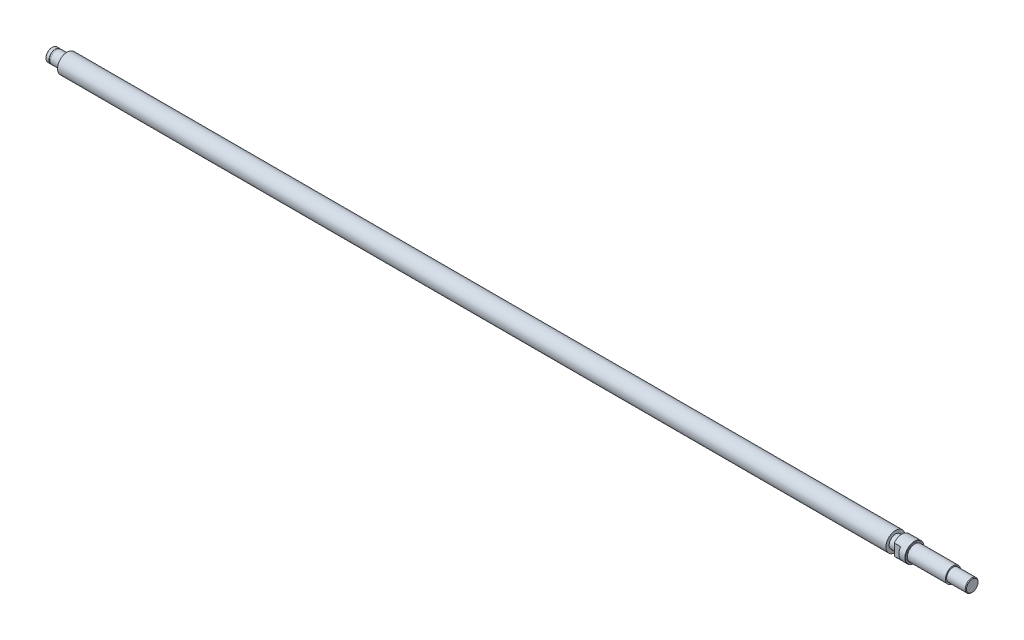
ISO-10303-21;
HEADER;
FILE_DESCRIPTION(('STEP AP214'),'2;1');
FILE_NAME('part.step','',(''),(''),'','','');
FILE_SCHEMA(('AUTOMOTIVE_DESIGN { 1 0 10303 214 1 1 1 1 }'));
ENDSEC;
DATA;
#1=APPLICATION_CONTEXT('core data for automotive mechanical design processes');
#2=APPLICATION_PROTOCOL_DEFINITION('international standard','automotive_design',2000,#1);
#3=PRODUCT_CONTEXT('',#1,'mechanical');
#4=PRODUCT('Part','Part','',(#3));
#5=PRODUCT_RELATED_PRODUCT_CATEGORY('part','',(#4));
#6=PRODUCT_DEFINITION_FORMATION('','',#4);
#7=PRODUCT_DEFINITION_CONTEXT('part definition',#1,'design');
#8=PRODUCT_DEFINITION('design','',#6,#7);
#9=PRODUCT_DEFINITION_SHAPE('','',#8);
#10=(LENGTH_UNIT() NAMED_UNIT(*) SI_UNIT(.MILLI.,.METRE.));
#11=(NAMED_UNIT(*) PLANE_ANGLE_UNIT() SI_UNIT($,.RADIAN.));
#12=(NAMED_UNIT(*) SI_UNIT($,.STERADIAN.) SOLID_ANGLE_UNIT());
#13=UNCERTAINTY_MEASURE_WITH_UNIT(LENGTH_MEASURE(1.E-05),#10,'distance_accuracy_value','');
#14=(GEOMETRIC_REPRESENTATION_CONTEXT(3) GLOBAL_UNCERTAINTY_ASSIGNED_CONTEXT((#13)) GLOBAL_UNIT_ASSIGNED_CONTEXT((#10,
#11,#12)) REPRESENTATION_CONTEXT('',''));
#15=CARTESIAN_POINT('',(0.,0.,0.));
#16=DIRECTION('',(0.,0.,1.));
#17=DIRECTION('',(1.,0.,0.));
#18=AXIS2_PLACEMENT_3D('',#15,#16,#17);
#19=CARTESIAN_POINT('',(675.,6.00000000000023,0.));
#20=DIRECTION('',(-1.,0.,0.));
#21=DIRECTION('',(0.,-1.,0.));
#22=AXIS2_PLACEMENT_3D('',#19,#20,#21);
#23=PLANE('',#22);
#24=CARTESIAN_POINT('',(675.,1.65327317884893E-13,0.));
#25=DIRECTION('',(-1.,0.,0.));
#26=DIRECTION('',(0.,-1.,0.));
#27=AXIS2_PLACEMENT_3D('',#24,#25,#26);
#28=CIRCLE('',#27,7.30000000000019);
#29=CARTESIAN_POINT('',(675.,-7.29999999999997,0.));
#30=VERTEX_POINT('',#29);
#31=EDGE_CURVE('E11',#30,#30,#28,.F.);
#32=ORIENTED_EDGE('',*,*,#31,.T.);
#33=EDGE_LOOP('',(#32));
#34=FACE_BOUND('',#33,.T.);
#35=CARTESIAN_POINT('',(675.,1.65327317884893E-13,0.));
#36=DIRECTION('',(-1.,0.,0.));
#37=DIRECTION('',(0.,-1.,0.));
#38=AXIS2_PLACEMENT_3D('',#35,#36,#37);
#39=CIRCLE('',#38,6.30000000000007);
#40=CARTESIAN_POINT('',(675.,-6.2999999999999,0.));
#41=VERTEX_POINT('',#40);
#42=EDGE_CURVE('E154',#41,#41,#39,.T.);
#43=ORIENTED_EDGE('',*,*,#42,.T.);
#44=EDGE_LOOP('',(#43));
#45=FACE_BOUND('',#44,.T.);
#46=ADVANCED_FACE('F43',(#34,#45),#23,.F.);
#47=CARTESIAN_POINT('',(0.,0.,0.));
#48=DIRECTION('',(-1.,0.,0.));
#49=DIRECTION('',(0.,-1.,0.));
#50=AXIS2_PLACEMENT_3D('',#47,#48,#49);
#51=CYLINDRICAL_SURFACE('',#50,7.50000000000009);
#52=CARTESIAN_POINT('',(674.8,1.65278332012927E-13,0.));
#53=DIRECTION('',(-1.,0.,0.));
#54=DIRECTION('',(0.,-1.,0.));
#55=AXIS2_PLACEMENT_3D('',#52,#53,#54);
#56=CIRCLE('',#55,7.50000000000009);
#57=CARTESIAN_POINT('',(674.8,-7.49999999999987,0.));
#58=VERTEX_POINT('',#57);
#59=EDGE_CURVE('E51',#58,#58,#56,.T.);
#60=ORIENTED_EDGE('',*,*,#59,.T.);
#61=EDGE_LOOP('',(#60));
#62=FACE_BOUND('',#61,.T.);
#63=CARTESIAN_POINT('',(670.,1.62878024286598E-13,0.));
#64=DIRECTION('',(-1.,0.,0.));
#65=DIRECTION('',(0.,0.,1.));
#66=AXIS2_PLACEMENT_3D('',#63,#64,#65);
#67=CIRCLE('',#66,7.50000000000035);
#68=CARTESIAN_POINT('',(670.,-4.50000000000042,6.));
#69=VERTEX_POINT('',#68);
#70=CARTESIAN_POINT('',(670.,4.50000000000075,6.));
#71=VERTEX_POINT('',#70);
#72=EDGE_CURVE('E87',#69,#71,#67,.T.);
#73=ORIENTED_EDGE('',*,*,#72,.F.);
#74=DIRECTION('',(-1.,0.,0.));
#75=VECTOR('',#74,1.);
#76=CARTESIAN_POINT('',(670.,-4.50000000000042,6.));
#77=LINE('',#76,#75);
#78=CARTESIAN_POINT('',(665.,-4.50000000000042,6.));
#79=VERTEX_POINT('',#78);
#80=EDGE_CURVE('E95',#69,#79,#77,.T.);
#81=ORIENTED_EDGE('',*,*,#80,.T.);
#82=CARTESIAN_POINT('',(665.,1.62878024286598E-13,0.));
#83=DIRECTION('',(-1.,0.,0.));
#84=DIRECTION('',(0.,-1.,0.));
#85=AXIS2_PLACEMENT_3D('',#82,#83,#84);
#86=CIRCLE('',#85,7.50000000000009);
#87=CARTESIAN_POINT('',(665.,-4.49999999999999,-6.));
#88=VERTEX_POINT('',#87);
#89=EDGE_CURVE('E145',#88,#79,#86,.T.);
#90=ORIENTED_EDGE('',*,*,#89,.F.);
#91=DIRECTION('',(-1.,0.,0.));
#92=VECTOR('',#91,1.);
#93=CARTESIAN_POINT('',(670.,-4.50000000000042,-6.));
#94=LINE('',#93,#92);
#95=CARTESIAN_POINT('',(670.,-4.50000000000042,-6.));
#96=VERTEX_POINT('',#95);
#97=EDGE_CURVE('E66',#96,#88,#94,.T.);
#98=ORIENTED_EDGE('',*,*,#97,.F.);
#99=CARTESIAN_POINT('',(670.,1.62878024286598E-13,0.));
#100=DIRECTION('',(-1.,0.,0.));
#101=DIRECTION('',(0.,0.,1.));
#102=AXIS2_PLACEMENT_3D('',#99,#100,#101);
#103=CIRCLE('',#102,7.50000000000035);
#104=CARTESIAN_POINT('',(670.,4.50000000000075,-6.));
#105=VERTEX_POINT('',#104);
#106=EDGE_CURVE('E106',#105,#96,#103,.T.);
#107=ORIENTED_EDGE('',*,*,#106,.F.);
#108=DIRECTION('',(-1.,0.,0.));
#109=VECTOR('',#108,1.);
#110=CARTESIAN_POINT('',(670.,4.50000000000075,-6.));
#111=LINE('',#110,#109);
#112=CARTESIAN_POINT('',(665.,4.50000000000075,-6.));
#113=VERTEX_POINT('',#112);
#114=EDGE_CURVE('E112',#105,#113,#111,.T.);
#115=ORIENTED_EDGE('',*,*,#114,.T.);
#116=CARTESIAN_POINT('',(665.,4.50000000000031,6.));
#117=VERTEX_POINT('',#116);
#118=EDGE_CURVE('E100',#117,#113,#86,.T.);
#119=ORIENTED_EDGE('',*,*,#118,.F.);
#120=DIRECTION('',(-1.,0.,0.));
#121=VECTOR('',#120,1.);
#122=CARTESIAN_POINT('',(670.,4.50000000000075,6.));
#123=LINE('',#122,#121);
#124=EDGE_CURVE('E58',#71,#117,#123,.T.);
#125=ORIENTED_EDGE('',*,*,#124,.F.);
#126=EDGE_LOOP('',(#73,#81,#90,#98,#107,#115,#119,#125));
#127=FACE_BOUND('',#126,.T.);
#128=ADVANCED_FACE('F98',(#62,#127),#51,.T.);
#129=CARTESIAN_POINT('',(665.,7.50000000000025,0.));
#130=DIRECTION('',(1.,0.,0.));
#131=DIRECTION('',(0.,1.,0.));
#132=AXIS2_PLACEMENT_3D('',#129,#130,#131);
#133=PLANE('',#132);
#134=CARTESIAN_POINT('',(665.,1.62878024286598E-13,0.));
#135=DIRECTION('',(-1.,0.,0.));
#136=DIRECTION('',(0.,-1.,0.));
#137=AXIS2_PLACEMENT_3D('',#134,#135,#136);
#138=CIRCLE('',#137,5.00000000000006);
#139=CARTESIAN_POINT('',(665.,-4.9999999999999,0.));
#140=VERTEX_POINT('',#139);
#141=EDGE_CURVE('E142',#140,#140,#138,.T.);
#142=ORIENTED_EDGE('',*,*,#141,.F.);
#143=EDGE_LOOP('',(#142));
#144=FACE_BOUND('',#143,.T.);
#145=ORIENTED_EDGE('',*,*,#89,.T.);
#146=DIRECTION('',(0.,-1.,0.));
#147=VECTOR('',#146,1.);
#148=CARTESIAN_POINT('',(665.,4.50000000000075,6.));
#149=LINE('',#148,#147);
#150=EDGE_CURVE('E92',#117,#79,#149,.T.);
#151=ORIENTED_EDGE('',*,*,#150,.F.);
#152=ORIENTED_EDGE('',*,*,#118,.T.);
#153=DIRECTION('',(0.,1.,0.));
#154=VECTOR('',#153,1.);
#155=CARTESIAN_POINT('',(665.,4.50000000000075,-6.));
#156=LINE('',#155,#154);
#157=EDGE_CURVE('E102',#88,#113,#156,.T.);
#158=ORIENTED_EDGE('',*,*,#157,.F.);
#159=EDGE_LOOP('',(#145,#151,#152,#158));
#160=FACE_BOUND('',#159,.T.);
#161=ADVANCED_FACE('F194',(#144,#160),#133,.F.);
#162=CARTESIAN_POINT('',(0.,0.,0.));
#163=DIRECTION('',(-1.,0.,0.));
#164=DIRECTION('',(0.,-1.,0.));
#165=AXIS2_PLACEMENT_3D('',#162,#163,#164);
#166=CYLINDRICAL_SURFACE('',#165,5.00000000000006);
#167=CARTESIAN_POINT('',(660.,1.61653377487451E-13,0.));
#168=DIRECTION('',(-1.,0.,0.));
#169=DIRECTION('',(0.,-1.,0.));
#170=AXIS2_PLACEMENT_3D('',#167,#168,#169);
#171=CIRCLE('',#170,5.00000000000006);
#172=CARTESIAN_POINT('',(660.,-4.9999999999999,0.));
#173=VERTEX_POINT('',#172);
#174=EDGE_CURVE('E139',#173,#173,#171,.T.);
#175=ORIENTED_EDGE('',*,*,#174,.F.);
#176=EDGE_LOOP('',(#175));
#177=FACE_BOUND('',#176,.T.);
#178=ORIENTED_EDGE('',*,*,#141,.T.);
#179=EDGE_LOOP('',(#178));
#180=FACE_BOUND('',#179,.T.);
#181=ADVANCED_FACE('F272',(#177,#180),#166,.T.);
#182=CARTESIAN_POINT('',(660.,5.00000000000022,0.));
#183=DIRECTION('',(-1.,0.,0.));
#184=DIRECTION('',(0.,-1.,0.));
#185=AXIS2_PLACEMENT_3D('',#182,#183,#184);
#186=PLANE('',#185);
#187=CARTESIAN_POINT('',(660.,1.61653377487451E-13,0.));
#188=DIRECTION('',(-1.,0.,0.));
#189=DIRECTION('',(0.,-1.,0.));
#190=AXIS2_PLACEMENT_3D('',#187,#188,#189);
#191=CIRCLE('',#190,7.49999999999993);
#192=CARTESIAN_POINT('',(660.,-7.49999999999977,0.));
#193=VERTEX_POINT('',#192);
#194=EDGE_CURVE('E136',#193,#193,#191,.T.);
#195=ORIENTED_EDGE('',*,*,#194,.F.);
#196=EDGE_LOOP('',(#195));
#197=FACE_BOUND('',#196,.T.);
#198=ORIENTED_EDGE('',*,*,#174,.T.);
#199=EDGE_LOOP('',(#198));
#200=FACE_BOUND('',#199,.T.);
#201=ADVANCED_FACE('F268',(#197,#200),#186,.F.);
#202=CARTESIAN_POINT('',(0.,0.,0.));
#203=DIRECTION('',(-1.,0.,0.));
#204=DIRECTION('',(0.,-1.,0.));
#205=AXIS2_PLACEMENT_3D('',#202,#203,#204);
#206=CYLINDRICAL_SURFACE('',#205,7.49999999999996);
#207=CARTESIAN_POINT('',(12.,0.,0.));
#208=DIRECTION('',(-1.,0.,0.));
#209=DIRECTION('',(0.,-1.,0.));
#210=AXIS2_PLACEMENT_3D('',#207,#208,#209);
#211=CIRCLE('',#210,7.49999999999999);
#212=CARTESIAN_POINT('',(12.,-7.49999999999999,0.));
#213=VERTEX_POINT('',#212);
#214=EDGE_CURVE('E133',#213,#213,#211,.T.);
#215=ORIENTED_EDGE('',*,*,#214,.F.);
#216=EDGE_LOOP('',(#215));
#217=FACE_BOUND('',#216,.T.);
#218=ORIENTED_EDGE('',*,*,#194,.T.);
#219=EDGE_LOOP('',(#218));
#220=FACE_BOUND('',#219,.T.);
#221=ADVANCED_FACE('F264',(#217,#220),#206,.T.);
#222=CARTESIAN_POINT('',(12.,7.49999999999999,0.));
#223=DIRECTION('',(1.,0.,0.));
#224=DIRECTION('',(0.,1.,0.));
#225=AXIS2_PLACEMENT_3D('',#222,#223,#224);
#226=PLANE('',#225);
#227=CARTESIAN_POINT('',(12.,0.,0.));
#228=DIRECTION('',(1.,0.,0.));
#229=DIRECTION('',(0.,1.,0.));
#230=AXIS2_PLACEMENT_3D('',#227,#228,#229);
#231=CIRCLE('',#230,5.3);
#232=CARTESIAN_POINT('',(12.,5.30000000000001,0.));
#233=VERTEX_POINT('',#232);
#234=EDGE_CURVE('E151',#233,#233,#231,.T.);
#235=ORIENTED_EDGE('',*,*,#234,.T.);
#236=EDGE_LOOP('',(#235));
#237=FACE_BOUND('',#236,.T.);
#238=ORIENTED_EDGE('',*,*,#214,.T.);
#239=EDGE_LOOP('',(#238));
#240=FACE_BOUND('',#239,.T.);
#241=ADVANCED_FACE('F260',(#237,#240),#226,.F.);
#242=CARTESIAN_POINT('',(0.,0.,0.));
#243=DIRECTION('',(-1.,0.,0.));
#244=DIRECTION('',(0.,-1.,0.));
#245=AXIS2_PLACEMENT_3D('',#242,#243,#244);
#246=CYLINDRICAL_SURFACE('',#245,5.);
#247=CARTESIAN_POINT('',(11.7,0.,0.));
#248=DIRECTION('',(1.,0.,0.));
#249=DIRECTION('',(0.,1.,0.));
#250=AXIS2_PLACEMENT_3D('',#247,#248,#249);
#251=CIRCLE('',#250,5.);
#252=CARTESIAN_POINT('',(11.7,5.00000000000001,0.));
#253=VERTEX_POINT('',#252);
#254=EDGE_CURVE('E148',#253,#253,#251,.F.);
#255=ORIENTED_EDGE('',*,*,#254,.T.);
#256=EDGE_LOOP('',(#255));
#257=FACE_BOUND('',#256,.T.);
#258=CARTESIAN_POINT('',(4.,0.,0.));
#259=DIRECTION('',(-1.,0.,0.));
#260=DIRECTION('',(0.,-1.,0.));
#261=AXIS2_PLACEMENT_3D('',#258,#259,#260);
#262=CIRCLE('',#261,5.);
#263=CARTESIAN_POINT('',(4.,-5.,0.));
#264=VERTEX_POINT('',#263);
#265=EDGE_CURVE('E130',#264,#264,#262,.T.);
#266=ORIENTED_EDGE('',*,*,#265,.F.);
#267=EDGE_LOOP('',(#266));
#268=FACE_BOUND('',#267,.T.);
#269=ADVANCED_FACE('F256',(#257,#268),#246,.T.);
#270=CARTESIAN_POINT('',(4.,5.,0.));
#271=DIRECTION('',(1.,0.,0.));
#272=DIRECTION('',(0.,1.,0.));
#273=AXIS2_PLACEMENT_3D('',#270,#271,#272);
#274=PLANE('',#273);
#275=CARTESIAN_POINT('',(4.,0.,0.));
#276=DIRECTION('',(-1.,0.,0.));
#277=DIRECTION('',(0.,-1.,0.));
#278=AXIS2_PLACEMENT_3D('',#275,#276,#277);
#279=CIRCLE('',#278,4.8);
#280=CARTESIAN_POINT('',(4.,-4.8,0.));
#281=VERTEX_POINT('',#280);
#282=EDGE_CURVE('E127',#281,#281,#279,.T.);
#283=ORIENTED_EDGE('',*,*,#282,.F.);
#284=EDGE_LOOP('',(#283));
#285=FACE_BOUND('',#284,.T.);
#286=ORIENTED_EDGE('',*,*,#265,.T.);
#287=EDGE_LOOP('',(#286));
#288=FACE_BOUND('',#287,.T.);
#289=ADVANCED_FACE('F252',(#285,#288),#274,.F.);
#290=CARTESIAN_POINT('',(0.,0.,0.));
#291=DIRECTION('',(-1.,0.,0.));
#292=DIRECTION('',(0.,-1.,0.));
#293=AXIS2_PLACEMENT_3D('',#290,#291,#292);
#294=CYLINDRICAL_SURFACE('',#293,4.8);
#295=CARTESIAN_POINT('',(2.85,0.,0.));
#296=DIRECTION('',(-1.,0.,0.));
#297=DIRECTION('',(0.,-1.,0.));
#298=AXIS2_PLACEMENT_3D('',#295,#296,#297);
#299=CIRCLE('',#298,4.8);
#300=CARTESIAN_POINT('',(2.85,-4.8,0.));
#301=VERTEX_POINT('',#300);
#302=EDGE_CURVE('E124',#301,#301,#299,.T.);
#303=ORIENTED_EDGE('',*,*,#302,.F.);
#304=EDGE_LOOP('',(#303));
#305=FACE_BOUND('',#304,.T.);
#306=ORIENTED_EDGE('',*,*,#282,.T.);
#307=EDGE_LOOP('',(#306));
#308=FACE_BOUND('',#307,.T.);
#309=ADVANCED_FACE('F248',(#305,#308),#294,.T.);
#310=CARTESIAN_POINT('',(2.85,4.8,0.));
#311=DIRECTION('',(-1.,0.,0.));
#312=DIRECTION('',(0.,-1.,0.));
#313=AXIS2_PLACEMENT_3D('',#310,#311,#312);
#314=PLANE('',#313);
#315=CARTESIAN_POINT('',(2.85,0.,0.));
#316=DIRECTION('',(-1.,0.,0.));
#317=DIRECTION('',(0.,-1.,0.));
#318=AXIS2_PLACEMENT_3D('',#315,#316,#317);
#319=CIRCLE('',#318,5.);
#320=CARTESIAN_POINT('',(2.85,-5.,0.));
#321=VERTEX_POINT('',#320);
#322=EDGE_CURVE('E121',#321,#321,#319,.T.);
#323=ORIENTED_EDGE('',*,*,#322,.F.);
#324=EDGE_LOOP('',(#323));
#325=FACE_BOUND('',#324,.T.);
#326=ORIENTED_EDGE('',*,*,#302,.T.);
#327=EDGE_LOOP('',(#326));
#328=FACE_BOUND('',#327,.T.);
#329=ADVANCED_FACE('F244',(#325,#328),#314,.F.);
#330=CARTESIAN_POINT('',(0.,0.,0.));
#331=DIRECTION('',(-1.,0.,0.));
#332=DIRECTION('',(0.,-1.,0.));
#333=AXIS2_PLACEMENT_3D('',#330,#331,#332);
#334=CYLINDRICAL_SURFACE('',#333,5.);
#335=CARTESIAN_POINT('',(0.499999999999849,0.,0.));
#336=DIRECTION('',(1.,0.,0.));
#337=DIRECTION('',(0.,1.,0.));
#338=AXIS2_PLACEMENT_3D('',#335,#336,#337);
#339=CIRCLE('',#338,5.);
#340=CARTESIAN_POINT('',(0.499999999999848,5.,0.));
#341=VERTEX_POINT('',#340);
#342=EDGE_CURVE('E169',#341,#341,#339,.T.);
#343=ORIENTED_EDGE('',*,*,#342,.T.);
#344=EDGE_LOOP('',(#343));
#345=FACE_BOUND('',#344,.T.);
#346=ORIENTED_EDGE('',*,*,#322,.T.);
#347=EDGE_LOOP('',(#346));
#348=FACE_BOUND('',#347,.T.);
#349=ADVANCED_FACE('F240',(#345,#348),#334,.T.);
#350=CARTESIAN_POINT('',(0.,5.,0.));
#351=DIRECTION('',(1.,0.,0.));
#352=DIRECTION('',(0.,1.,0.));
#353=AXIS2_PLACEMENT_3D('',#350,#351,#352);
#354=PLANE('',#353);
#355=CARTESIAN_POINT('',(0.,0.,0.));
#356=DIRECTION('',(1.,0.,0.));
#357=DIRECTION('',(0.,1.,0.));
#358=AXIS2_PLACEMENT_3D('',#355,#356,#357);
#359=CIRCLE('',#358,4.50000000000006);
#360=CARTESIAN_POINT('',(0.,4.50000000000006,0.));
#361=VERTEX_POINT('',#360);
#362=EDGE_CURVE('E166',#361,#361,#359,.F.);
#363=ORIENTED_EDGE('',*,*,#362,.T.);
#364=EDGE_LOOP('',(#363));
#365=FACE_BOUND('',#364,.T.);
#366=ADVANCED_FACE('F236',(#365),#354,.F.);
#367=CARTESIAN_POINT('',(720.,1.76349139077219E-13,0.));
#368=DIRECTION('',(-1.,0.,0.));
#369=DIRECTION('',(0.,-1.,0.));
#370=AXIS2_PLACEMENT_3D('',#367,#368,#369);
#371=PLANE('',#370);
#372=CARTESIAN_POINT('',(720.,1.76349139077219E-13,0.));
#373=DIRECTION('',(-1.,0.,0.));
#374=DIRECTION('',(0.,-1.,0.));
#375=AXIS2_PLACEMENT_3D('',#372,#373,#374);
#376=CIRCLE('',#375,4.50000000000017);
#377=CARTESIAN_POINT('',(720.,-4.49999999999999,0.));
#378=VERTEX_POINT('',#377);
#379=EDGE_CURVE('E163',#378,#378,#376,.F.);
#380=ORIENTED_EDGE('',*,*,#379,.T.);
#381=EDGE_LOOP('',(#380));
#382=FACE_BOUND('',#381,.T.);
#383=ADVANCED_FACE('F220',(#382),#371,.F.);
#384=CARTESIAN_POINT('',(0.,0.,0.));
#385=DIRECTION('',(-1.,0.,0.));
#386=DIRECTION('',(0.,-1.,0.));
#387=AXIS2_PLACEMENT_3D('',#384,#385,#386);
#388=CYLINDRICAL_SURFACE('',#387,5.00000000000007);
#389=CARTESIAN_POINT('',(719.5,1.76226674397304E-13,0.));
#390=DIRECTION('',(-1.,0.,0.));
#391=DIRECTION('',(0.,-1.,0.));
#392=AXIS2_PLACEMENT_3D('',#389,#390,#391);
#393=CIRCLE('',#392,5.00000000000007);
#394=CARTESIAN_POINT('',(719.5,-4.99999999999989,0.));
#395=VERTEX_POINT('',#394);
#396=EDGE_CURVE('E160',#395,#395,#393,.T.);
#397=ORIENTED_EDGE('',*,*,#396,.T.);
#398=EDGE_LOOP('',(#397));
#399=FACE_BOUND('',#398,.T.);
#400=CARTESIAN_POINT('',(705.,1.72675198679777E-13,0.));
#401=DIRECTION('',(-1.,0.,0.));
#402=DIRECTION('',(0.,-1.,0.));
#403=AXIS2_PLACEMENT_3D('',#400,#401,#402);
#404=CIRCLE('',#403,5.00000000000007);
#405=CARTESIAN_POINT('',(705.,-4.9999999999999,0.));
#406=VERTEX_POINT('',#405);
#407=EDGE_CURVE('E118',#406,#406,#404,.T.);
#408=ORIENTED_EDGE('',*,*,#407,.F.);
#409=EDGE_LOOP('',(#408));
#410=FACE_BOUND('',#409,.T.);
#411=ADVANCED_FACE('F216',(#399,#410),#388,.T.);
#412=CARTESIAN_POINT('',(705.,5.00000000000024,0.));
#413=DIRECTION('',(-1.,0.,0.));
#414=DIRECTION('',(0.,-1.,0.));
#415=AXIS2_PLACEMENT_3D('',#412,#413,#414);
#416=PLANE('',#415);
#417=CARTESIAN_POINT('',(705.,1.72675198679777E-13,0.));
#418=DIRECTION('',(-1.,0.,0.));
#419=DIRECTION('',(0.,-1.,0.));
#420=AXIS2_PLACEMENT_3D('',#417,#418,#419);
#421=CIRCLE('',#420,6.00000000000007);
#422=CARTESIAN_POINT('',(705.,-5.9999999999999,0.));
#423=VERTEX_POINT('',#422);
#424=EDGE_CURVE('E114',#423,#423,#421,.T.);
#425=ORIENTED_EDGE('',*,*,#424,.F.);
#426=EDGE_LOOP('',(#425));
#427=FACE_BOUND('',#426,.T.);
#428=ORIENTED_EDGE('',*,*,#407,.T.);
#429=EDGE_LOOP('',(#428));
#430=FACE_BOUND('',#429,.T.);
#431=ADVANCED_FACE('F219',(#427,#430),#416,.F.);
#432=CARTESIAN_POINT('',(0.,0.,0.));
#433=DIRECTION('',(-1.,0.,0.));
#434=DIRECTION('',(0.,-1.,0.));
#435=AXIS2_PLACEMENT_3D('',#432,#433,#434);
#436=CYLINDRICAL_SURFACE('',#435,6.00000000000007);
#437=CARTESIAN_POINT('',(675.3,1.65400796692842E-13,0.));
#438=DIRECTION('',(-1.,0.,0.));
#439=DIRECTION('',(0.,-1.,0.));
#440=AXIS2_PLACEMENT_3D('',#437,#438,#439);
#441=CIRCLE('',#440,6.00000000000007);
#442=CARTESIAN_POINT('',(675.3,-5.9999999999999,0.));
#443=VERTEX_POINT('',#442);
#444=EDGE_CURVE('E157',#443,#443,#441,.F.);
#445=ORIENTED_EDGE('',*,*,#444,.T.);
#446=EDGE_LOOP('',(#445));
#447=FACE_BOUND('',#446,.T.);
#448=ORIENTED_EDGE('',*,*,#424,.T.);
#449=EDGE_LOOP('',(#448));
#450=FACE_BOUND('',#449,.T.);
#451=ADVANCED_FACE('F203',(#447,#450),#436,.T.);
#452=CARTESIAN_POINT('',(11.7,0.,0.));
#453=DIRECTION('',(1.,0.,0.));
#454=DIRECTION('',(0.,1.,0.));
#455=AXIS2_PLACEMENT_3D('',#452,#453,#454);
#456=TOROIDAL_SURFACE('',#455,5.3,0.3);
#457=ORIENTED_EDGE('',*,*,#234,.F.);
#458=EDGE_LOOP('',(#457));
#459=FACE_BOUND('',#458,.T.);
#460=ORIENTED_EDGE('',*,*,#254,.F.);
#461=EDGE_LOOP('',(#460));
#462=FACE_BOUND('',#461,.T.);
#463=ADVANCED_FACE('F199',(#459,#462),#456,.F.);
#464=CARTESIAN_POINT('',(675.3,1.65400796692842E-13,0.));
#465=DIRECTION('',(-1.,0.,0.));
#466=DIRECTION('',(0.,-1.,0.));
#467=AXIS2_PLACEMENT_3D('',#464,#465,#466);
#468=TOROIDAL_SURFACE('',#467,6.30000000000007,0.3);
#469=ORIENTED_EDGE('',*,*,#444,.F.);
#470=EDGE_LOOP('',(#469));
#471=FACE_BOUND('',#470,.T.);
#472=ORIENTED_EDGE('',*,*,#42,.F.);
#473=EDGE_LOOP('',(#472));
#474=FACE_BOUND('',#473,.T.);
#475=ADVANCED_FACE('F202',(#471,#474),#468,.F.);
#476=CARTESIAN_POINT('',(719.5,1.76226674397304E-13,0.));
#477=DIRECTION('',(-1.,0.,0.));
#478=DIRECTION('',(0.,-1.,0.));
#479=AXIS2_PLACEMENT_3D('',#476,#477,#478);
#480=CONICAL_SURFACE('',#479,5.00000000000007,0.785398163397405);
#481=ORIENTED_EDGE('',*,*,#379,.F.);
#482=EDGE_LOOP('',(#481));
#483=FACE_BOUND('',#482,.T.);
#484=ORIENTED_EDGE('',*,*,#396,.F.);
#485=EDGE_LOOP('',(#484));
#486=FACE_BOUND('',#485,.T.);
#487=ADVANCED_FACE('F185',(#483,#486),#480,.T.);
#488=CARTESIAN_POINT('',(0.,0.,0.));
#489=DIRECTION('',(1.,0.,0.));
#490=DIRECTION('',(0.,1.,0.));
#491=AXIS2_PLACEMENT_3D('',#488,#489,#490);
#492=CONICAL_SURFACE('',#491,4.50000000000006,0.785398163397542);
#493=ORIENTED_EDGE('',*,*,#342,.F.);
#494=EDGE_LOOP('',(#493));
#495=FACE_BOUND('',#494,.T.);
#496=ORIENTED_EDGE('',*,*,#362,.F.);
#497=EDGE_LOOP('',(#496));
#498=FACE_BOUND('',#497,.T.);
#499=ADVANCED_FACE('F177',(#495,#498),#492,.T.);
#500=CARTESIAN_POINT('',(674.8,1.65278332012927E-13,0.));
#501=DIRECTION('',(-1.,0.,0.));
#502=DIRECTION('',(0.,-1.,0.));
#503=AXIS2_PLACEMENT_3D('',#500,#501,#502);
#504=CONICAL_SURFACE('',#503,7.50000000000009,0.785398163397249);
#505=CARTESIAN_POINT('',(675.,-7.29999999999997,0.));
#506=CARTESIAN_POINT('',(674.997916666667,-7.3020833333333,0.));
#507=CARTESIAN_POINT('',(674.995833333333,-7.30416666666664,0.));
#508=CARTESIAN_POINT('',(674.991666666667,-7.3083333333333,0.));
#509=CARTESIAN_POINT('',(674.989583333333,-7.31041666666663,0.));
#510=CARTESIAN_POINT('',(674.985416666667,-7.3145833333333,0.));
#511=CARTESIAN_POINT('',(674.983333333333,-7.31666666666663,0.));
#512=CARTESIAN_POINT('',(674.979166666667,-7.32083333333329,0.));
#513=CARTESIAN_POINT('',(674.977083333333,-7.32291666666663,0.));
#514=CARTESIAN_POINT('',(674.972916666667,-7.32708333333329,0.));
#515=CARTESIAN_POINT('',(674.970833333333,-7.32916666666663,0.));
#516=CARTESIAN_POINT('',(674.966666666667,-7.33333333333329,0.));
#517=CARTESIAN_POINT('',(674.964583333333,-7.33541666666662,0.));
#518=CARTESIAN_POINT('',(674.960416666667,-7.33958333333329,0.));
#519=CARTESIAN_POINT('',(674.958333333333,-7.34166666666663,0.));
#520=CARTESIAN_POINT('',(674.954166666667,-7.34583333333329,0.));
#521=CARTESIAN_POINT('',(674.952083333333,-7.34791666666661,0.));
#522=CARTESIAN_POINT('',(674.947916666667,-7.35208333333327,0.));
#523=CARTESIAN_POINT('',(674.945833333333,-7.35416666666661,0.));
#524=CARTESIAN_POINT('',(674.941666666667,-7.35833333333328,0.));
#525=CARTESIAN_POINT('',(674.939583333333,-7.36041666666661,0.));
#526=CARTESIAN_POINT('',(674.935416666667,-7.36458333333327,0.));
#527=CARTESIAN_POINT('',(674.933333333333,-7.3666666666666,0.));
#528=CARTESIAN_POINT('',(674.929166666667,-7.37083333333327,0.));
#529=CARTESIAN_POINT('',(674.927083333333,-7.3729166666666,0.));
#530=CARTESIAN_POINT('',(674.922916666667,-7.37708333333327,0.));
#531=CARTESIAN_POINT('',(674.920833333333,-7.3791666666666,0.));
#532=CARTESIAN_POINT('',(674.916666666667,-7.38333333333326,0.));
#533=CARTESIAN_POINT('',(674.914583333333,-7.38541666666659,0.));
#534=CARTESIAN_POINT('',(674.910416666667,-7.38958333333326,0.));
#535=CARTESIAN_POINT('',(674.908333333333,-7.3916666666666,0.));
#536=CARTESIAN_POINT('',(674.904166666667,-7.39583333333326,0.));
#537=CARTESIAN_POINT('',(674.902083333333,-7.39791666666658,0.));
#538=CARTESIAN_POINT('',(674.897916666667,-7.40208333333324,0.));
#539=CARTESIAN_POINT('',(674.895833333333,-7.40416666666658,0.));
#540=CARTESIAN_POINT('',(674.891666666667,-7.40833333333325,0.));
#541=CARTESIAN_POINT('',(674.889583333333,-7.41041666666658,0.));
#542=CARTESIAN_POINT('',(674.885416666667,-7.41458333333325,0.));
#543=CARTESIAN_POINT('',(674.883333333333,-7.41666666666658,0.));
#544=CARTESIAN_POINT('',(674.879166666667,-7.42083333333324,0.));
#545=CARTESIAN_POINT('',(674.877083333333,-7.42291666666658,0.));
#546=CARTESIAN_POINT('',(674.872916666667,-7.42708333333324,0.));
#547=CARTESIAN_POINT('',(674.870833333333,-7.42916666666657,0.));
#548=CARTESIAN_POINT('',(674.866666666667,-7.43333333333324,0.));
#549=CARTESIAN_POINT('',(674.864583333333,-7.43541666666657,0.));
#550=CARTESIAN_POINT('',(674.860416666667,-7.43958333333324,0.));
#551=CARTESIAN_POINT('',(674.858333333333,-7.44166666666658,0.));
#552=CARTESIAN_POINT('',(674.854166666667,-7.44583333333324,0.));
#553=CARTESIAN_POINT('',(674.852083333333,-7.44791666666656,0.));
#554=CARTESIAN_POINT('',(674.847916666667,-7.45208333333322,0.));
#555=CARTESIAN_POINT('',(674.845833333333,-7.45416666666656,0.));
#556=CARTESIAN_POINT('',(674.841666666667,-7.45833333333323,0.));
#557=CARTESIAN_POINT('',(674.839583333333,-7.46041666666656,0.));
#558=CARTESIAN_POINT('',(674.835416666667,-7.46458333333322,0.));
#559=CARTESIAN_POINT('',(674.833333333333,-7.46666666666655,0.));
#560=CARTESIAN_POINT('',(674.829166666667,-7.47083333333322,0.));
#561=CARTESIAN_POINT('',(674.827083333333,-7.47291666666655,0.));
#562=CARTESIAN_POINT('',(674.822916666667,-7.47708333333322,0.));
#563=CARTESIAN_POINT('',(674.820833333333,-7.47916666666655,0.));
#564=CARTESIAN_POINT('',(674.816666666667,-7.48333333333321,0.));
#565=CARTESIAN_POINT('',(674.814583333333,-7.48541666666654,0.));
#566=CARTESIAN_POINT('',(674.810416666667,-7.48958333333321,0.));
#567=CARTESIAN_POINT('',(674.808333333333,-7.49166666666655,0.));
#568=CARTESIAN_POINT('',(674.804166666667,-7.49583333333322,0.));
#569=CARTESIAN_POINT('',(674.802083333333,-7.49791666666656,0.));
#570=CARTESIAN_POINT('',(674.8,-7.49999999999987,0.));
#571=B_SPLINE_CURVE_WITH_KNOTS('',3,(#505,#506,#507,#508,#509,#510,#511,#512,#513,#514,#515,
#516,#517,#518,#519,#520,#521,#522,#523,#524,#525,#526,#527,#528,#529,#530,#531,#532,#533,#534,
#535,#536,#537,#538,#539,#540,#541,#542,#543,#544,#545,#546,#547,#548,#549,#550,#551,#552,#553,
#554,#555,#556,#557,#558,#559,#560,#561,#562,#563,#564,#565,#566,#567,#568,#569,#570),
.UNSPECIFIED.,.F.,.F.,(4,2,2,2,2,2,2,2,2,2,2,2,2,2,2,2,2,2,2,2,2,2,2,2,2,2,2,2,2,2,2,2,4),(0.,
0.00883883476481922,0.0176776695296384,0.0265165042944576,0.0353553390592775,0.0441941738240967,
0.0530330085889159,0.0618718433537351,0.0707106781186329,0.0795495128834521,0.0883883476482713,
0.0972271824130905,0.10606601717791,0.11490485194273,0.123743686707549,0.132582521472368,
0.141421356237266,0.150260191002085,0.159099025766904,0.167937860531723,0.176776695296543,
0.185615530061362,0.194454364826182,0.203293199591001,0.212132034355899,0.220970869120718,
0.229809703885537,0.238648538650356,0.247487373415176,0.256326208179995,0.265165042944815,
0.274003877709634,0.282842712474532),.UNSPECIFIED.);
#572=EDGE_CURVE('BSEAM45',#30,#58,#571,.T.);
#573=ORIENTED_EDGE('',*,*,#31,.F.);
#574=ORIENTED_EDGE('',*,*,#59,.F.);
#575=ORIENTED_EDGE('',*,*,#572,.T.);
#576=ORIENTED_EDGE('',*,*,#572,.F.);
#577=EDGE_LOOP('',(#573,#575,#574,#576));
#578=FACE_BOUND('',#577,.T.);
#579=ADVANCED_FACE('F45',(#578),#504,.T.);
#580=CARTESIAN_POINT('',(670.,4.50000000000075,-6.));
#581=DIRECTION('',(0.,0.,1.));
#582=DIRECTION('',(1.,0.,0.));
#583=AXIS2_PLACEMENT_3D('',#580,#581,#582);
#584=PLANE('',#583);
#585=ORIENTED_EDGE('',*,*,#157,.T.);
#586=ORIENTED_EDGE('',*,*,#114,.F.);
#587=DIRECTION('',(0.,1.,0.));
#588=VECTOR('',#587,1.);
#589=CARTESIAN_POINT('',(670.,4.50000000000075,-6.));
#590=LINE('',#589,#588);
#591=EDGE_CURVE('E108',#96,#105,#590,.T.);
#592=ORIENTED_EDGE('',*,*,#591,.F.);
#593=ORIENTED_EDGE('',*,*,#97,.T.);
#594=EDGE_LOOP('',(#585,#586,#592,#593));
#595=FACE_BOUND('',#594,.T.);
#596=ADVANCED_FACE('F176',(#595),#584,.F.);
#597=CARTESIAN_POINT('',(670.,1.62878024286598E-13,0.));
#598=DIRECTION('',(-1.,0.,0.));
#599=DIRECTION('',(0.,0.,1.));
#600=AXIS2_PLACEMENT_3D('',#597,#598,#599);
#601=PLANE('',#600);
#602=ORIENTED_EDGE('',*,*,#106,.T.);
#603=ORIENTED_EDGE('',*,*,#591,.T.);
#604=EDGE_LOOP('',(#602,#603));
#605=FACE_BOUND('',#604,.T.);
#606=ADVANCED_FACE('F183',(#605),#601,.T.);
#607=CARTESIAN_POINT('',(670.,4.50000000000075,6.));
#608=DIRECTION('',(0.,0.,-1.));
#609=DIRECTION('',(-1.,0.,0.));
#610=AXIS2_PLACEMENT_3D('',#607,#608,#609);
#611=PLANE('',#610);
#612=ORIENTED_EDGE('',*,*,#150,.T.);
#613=ORIENTED_EDGE('',*,*,#80,.F.);
#614=DIRECTION('',(0.,-1.,0.));
#615=VECTOR('',#614,1.);
#616=CARTESIAN_POINT('',(670.,4.50000000000075,6.));
#617=LINE('',#616,#615);
#618=EDGE_CURVE('E89',#71,#69,#617,.T.);
#619=ORIENTED_EDGE('',*,*,#618,.F.);
#620=ORIENTED_EDGE('',*,*,#124,.T.);
#621=EDGE_LOOP('',(#612,#613,#619,#620));
#622=FACE_BOUND('',#621,.T.);
#623=ADVANCED_FACE('F94',(#622),#611,.F.);
#624=CARTESIAN_POINT('',(670.,1.62878024286598E-13,0.));
#625=DIRECTION('',(-1.,0.,0.));
#626=DIRECTION('',(0.,0.,1.));
#627=AXIS2_PLACEMENT_3D('',#624,#625,#626);
#628=PLANE('',#627);
#629=ORIENTED_EDGE('',*,*,#72,.T.);
#630=ORIENTED_EDGE('',*,*,#618,.T.);
#631=EDGE_LOOP('',(#629,#630));
#632=FACE_BOUND('',#631,.T.);
#633=ADVANCED_FACE('F88',(#632),#628,.T.);
#634=CLOSED_SHELL('',(#46,#128,#161,#181,#201,#221,#241,#269,#289,#309,#329,#349,#366,#383,#411,
#431,#451,#463,#475,#487,#499,#579,#596,#606,#623,#633));
#635=MANIFOLD_SOLID_BREP('B2',#634);
#636=ADVANCED_BREP_SHAPE_REPRESENTATION('',(#18,#635),#14);
#637=SHAPE_DEFINITION_REPRESENTATION(#9,#636);
ENDSEC;
END-ISO-10303-21;
